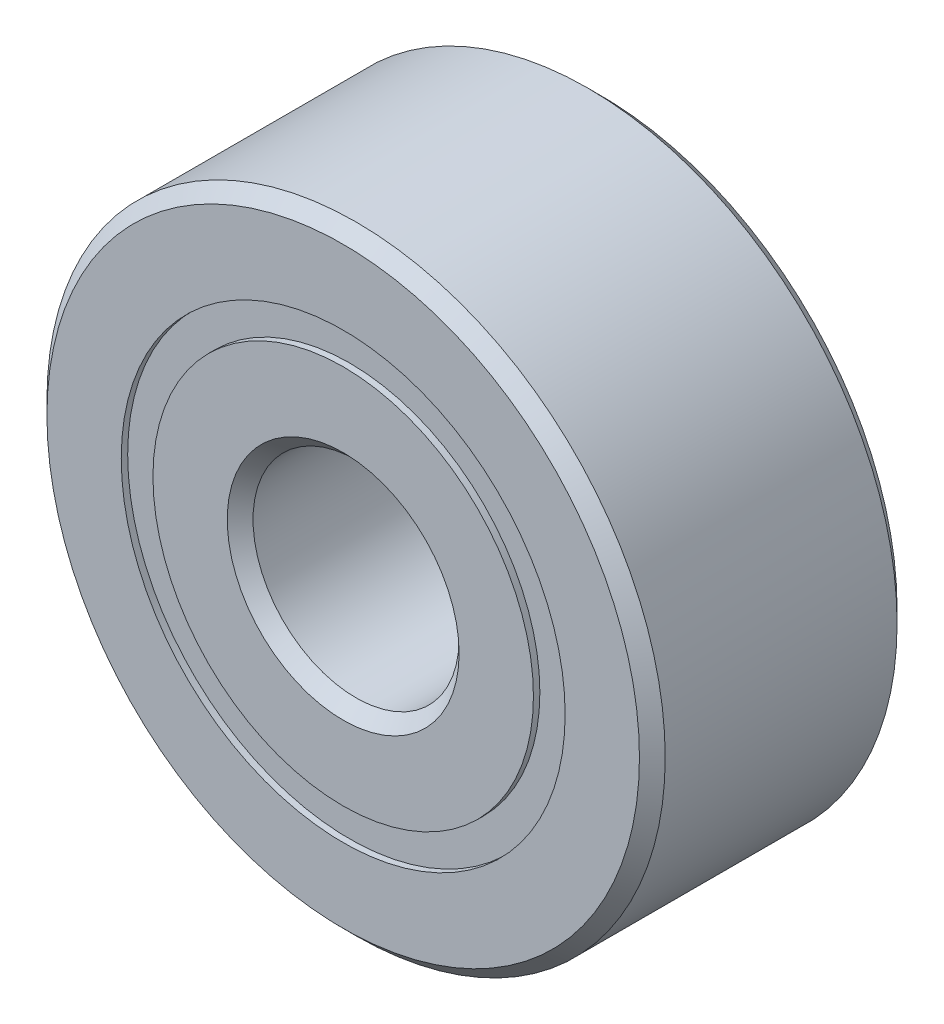
ISO-10303-21;
HEADER;
FILE_DESCRIPTION(('STEP AP214'),'2;1');
FILE_NAME('part.step','',(''),(''),'','','');
FILE_SCHEMA(('AUTOMOTIVE_DESIGN { 1 0 10303 214 1 1 1 1 }'));
ENDSEC;
DATA;
#1=APPLICATION_CONTEXT('core data for automotive mechanical design processes');
#2=APPLICATION_PROTOCOL_DEFINITION('international standard','automotive_design',2000,#1);
#3=PRODUCT_CONTEXT('',#1,'mechanical');
#4=PRODUCT('Part','Part','',(#3));
#5=PRODUCT_RELATED_PRODUCT_CATEGORY('part','',(#4));
#6=PRODUCT_DEFINITION_FORMATION('','',#4);
#7=PRODUCT_DEFINITION_CONTEXT('part definition',#1,'design');
#8=PRODUCT_DEFINITION('design','',#6,#7);
#9=PRODUCT_DEFINITION_SHAPE('','',#8);
#10=(LENGTH_UNIT() NAMED_UNIT(*) SI_UNIT(.MILLI.,.METRE.));
#11=(NAMED_UNIT(*) PLANE_ANGLE_UNIT() SI_UNIT($,.RADIAN.));
#12=(NAMED_UNIT(*) SI_UNIT($,.STERADIAN.) SOLID_ANGLE_UNIT());
#13=UNCERTAINTY_MEASURE_WITH_UNIT(LENGTH_MEASURE(1.E-05),#10,'distance_accuracy_value','');
#14=(GEOMETRIC_REPRESENTATION_CONTEXT(3) GLOBAL_UNCERTAINTY_ASSIGNED_CONTEXT((#13)) GLOBAL_UNIT_ASSIGNED_CONTEXT((#10,
#11,#12)) REPRESENTATION_CONTEXT('',''));
#15=CARTESIAN_POINT('',(0.,0.,0.));
#16=DIRECTION('',(0.,0.,1.));
#17=DIRECTION('',(1.,0.,0.));
#18=AXIS2_PLACEMENT_3D('',#15,#16,#17);
#19=CARTESIAN_POINT('',(0.,3.41923076923077,-1.88515625));
#20=DIRECTION('',(0.,0.,1.));
#21=DIRECTION('',(1.,0.,0.));
#22=AXIS2_PLACEMENT_3D('',#19,#20,#21);
#23=PLANE('',#22);
#24=CARTESIAN_POINT('',(0.,0.,-1.88515625));
#25=DIRECTION('',(0.,0.,1.));
#26=DIRECTION('',(1.,0.,0.));
#27=AXIS2_PLACEMENT_3D('',#24,#25,#26);
#28=CIRCLE('',#27,3.41923076923077);
#29=CARTESIAN_POINT('',(3.41923076923077,0.,-1.88515625));
#30=VERTEX_POINT('',#29);
#31=EDGE_CURVE('E57',#30,#30,#28,.T.);
#32=ORIENTED_EDGE('',*,*,#31,.F.);
#33=EDGE_LOOP('',(#32));
#34=FACE_BOUND('',#33,.T.);
#35=CARTESIAN_POINT('',(0.,0.,-1.88515625));
#36=DIRECTION('',(0.,0.,1.));
#37=DIRECTION('',(1.,0.,0.));
#38=AXIS2_PLACEMENT_3D('',#35,#36,#37);
#39=CIRCLE('',#38,2.93076923076923);
#40=CARTESIAN_POINT('',(2.93076923076923,0.,-1.88515625));
#41=VERTEX_POINT('',#40);
#42=EDGE_CURVE('E11',#41,#41,#39,.T.);
#43=ORIENTED_EDGE('',*,*,#42,.T.);
#44=EDGE_LOOP('',(#43));
#45=FACE_BOUND('',#44,.T.);
#46=ADVANCED_FACE('F43',(#34,#45),#23,.F.);
#47=CARTESIAN_POINT('',(0.,0.,1.984375));
#48=DIRECTION('',(0.,0.,1.));
#49=DIRECTION('',(1.,0.,0.));
#50=AXIS2_PLACEMENT_3D('',#47,#48,#49);
#51=CYLINDRICAL_SURFACE('',#50,2.93076923076923);
#52=ORIENTED_EDGE('',*,*,#42,.F.);
#53=EDGE_LOOP('',(#52));
#54=FACE_BOUND('',#53,.T.);
#55=CARTESIAN_POINT('',(0.,0.,-0.915136422466879));
#56=DIRECTION('',(0.,0.,1.));
#57=DIRECTION('',(1.,0.,0.));
#58=AXIS2_PLACEMENT_3D('',#55,#56,#57);
#59=CIRCLE('',#58,2.93076923076923);
#60=CARTESIAN_POINT('',(2.93076923076923,0.,-0.915136422466879));
#61=VERTEX_POINT('',#60);
#62=EDGE_CURVE('E49',#61,#61,#59,.T.);
#63=ORIENTED_EDGE('',*,*,#62,.T.);
#64=EDGE_LOOP('',(#63));
#65=FACE_BOUND('',#64,.T.);
#66=ADVANCED_FACE('F66',(#54,#65),#51,.F.);
#67=CARTESIAN_POINT('',(0.,3.41923076923077,-0.915136422466879));
#68=DIRECTION('',(0.,0.,-1.));
#69=DIRECTION('',(-1.,0.,0.));
#70=AXIS2_PLACEMENT_3D('',#67,#68,#69);
#71=PLANE('',#70);
#72=ORIENTED_EDGE('',*,*,#62,.F.);
#73=EDGE_LOOP('',(#72));
#74=FACE_BOUND('',#73,.T.);
#75=CARTESIAN_POINT('',(0.,0.,-0.915136422466878));
#76=DIRECTION('',(0.,0.,1.));
#77=DIRECTION('',(1.,0.,0.));
#78=AXIS2_PLACEMENT_3D('',#75,#76,#77);
#79=CIRCLE('',#78,3.41923076923077);
#80=CARTESIAN_POINT('',(3.41923076923077,0.,-0.915136422466878));
#81=VERTEX_POINT('',#80);
#82=EDGE_CURVE('E53',#81,#81,#79,.T.);
#83=ORIENTED_EDGE('',*,*,#82,.T.);
#84=EDGE_LOOP('',(#83));
#85=FACE_BOUND('',#84,.T.);
#86=ADVANCED_FACE('F70',(#74,#85),#71,.F.);
#87=CARTESIAN_POINT('',(0.,0.,1.984375));
#88=DIRECTION('',(0.,0.,1.));
#89=DIRECTION('',(1.,0.,0.));
#90=AXIS2_PLACEMENT_3D('',#87,#88,#89);
#91=CYLINDRICAL_SURFACE('',#90,3.41923076923077);
#92=ORIENTED_EDGE('',*,*,#82,.F.);
#93=EDGE_LOOP('',(#92));
#94=FACE_BOUND('',#93,.T.);
#95=ORIENTED_EDGE('',*,*,#31,.T.);
#96=EDGE_LOOP('',(#95));
#97=FACE_BOUND('',#96,.T.);
#98=ADVANCED_FACE('F63',(#94,#97),#91,.T.);
#99=CLOSED_SHELL('',(#46,#66,#86,#98));
#100=MANIFOLD_SOLID_BREP('B2',#99);
#101=CARTESIAN_POINT('',(0.,3.41923076923077,1.88515625));
#102=DIRECTION('',(0.,0.,-1.));
#103=DIRECTION('',(-1.,0.,0.));
#104=AXIS2_PLACEMENT_3D('',#101,#102,#103);
#105=PLANE('',#104);
#106=CARTESIAN_POINT('',(0.,0.,1.88515625));
#107=DIRECTION('',(0.,0.,1.));
#108=DIRECTION('',(1.,0.,0.));
#109=AXIS2_PLACEMENT_3D('',#106,#107,#108);
#110=CIRCLE('',#109,2.93076923076923);
#111=CARTESIAN_POINT('',(2.93076923076923,0.,1.88515625));
#112=VERTEX_POINT('',#111);
#113=EDGE_CURVE('E42',#112,#112,#110,.T.);
#114=ORIENTED_EDGE('',*,*,#113,.F.);
#115=EDGE_LOOP('',(#114));
#116=FACE_BOUND('',#115,.T.);
#117=CARTESIAN_POINT('',(0.,0.,1.88515625));
#118=DIRECTION('',(0.,0.,1.));
#119=DIRECTION('',(1.,0.,0.));
#120=AXIS2_PLACEMENT_3D('',#117,#118,#119);
#121=CIRCLE('',#120,3.41923076923077);
#122=CARTESIAN_POINT('',(3.41923076923077,0.,1.88515625));
#123=VERTEX_POINT('',#122);
#124=EDGE_CURVE('E124',#123,#123,#121,.T.);
#125=ORIENTED_EDGE('',*,*,#124,.T.);
#126=EDGE_LOOP('',(#125));
#127=FACE_BOUND('',#126,.T.);
#128=ADVANCED_FACE('F110',(#116,#127),#105,.F.);
#129=CARTESIAN_POINT('',(0.,0.,1.984375));
#130=DIRECTION('',(0.,0.,1.));
#131=DIRECTION('',(1.,0.,0.));
#132=AXIS2_PLACEMENT_3D('',#129,#130,#131);
#133=CYLINDRICAL_SURFACE('',#132,2.93076923076923);
#134=CARTESIAN_POINT('',(0.,0.,0.915136422466873));
#135=DIRECTION('',(0.,0.,1.));
#136=DIRECTION('',(1.,0.,0.));
#137=AXIS2_PLACEMENT_3D('',#134,#135,#136);
#138=CIRCLE('',#137,2.93076923076923);
#139=CARTESIAN_POINT('',(2.93076923076923,0.,0.915136422466873));
#140=VERTEX_POINT('',#139);
#141=EDGE_CURVE('E116',#140,#140,#138,.T.);
#142=ORIENTED_EDGE('',*,*,#141,.F.);
#143=EDGE_LOOP('',(#142));
#144=FACE_BOUND('',#143,.T.);
#145=ORIENTED_EDGE('',*,*,#113,.T.);
#146=EDGE_LOOP('',(#145));
#147=FACE_BOUND('',#146,.T.);
#148=ADVANCED_FACE('F139',(#144,#147),#133,.F.);
#149=CARTESIAN_POINT('',(0.,3.41923076923077,0.915136422466873));
#150=DIRECTION('',(0.,0.,1.));
#151=DIRECTION('',(1.,0.,0.));
#152=AXIS2_PLACEMENT_3D('',#149,#150,#151);
#153=PLANE('',#152);
#154=CARTESIAN_POINT('',(0.,0.,0.915136422466873));
#155=DIRECTION('',(0.,0.,1.));
#156=DIRECTION('',(1.,0.,0.));
#157=AXIS2_PLACEMENT_3D('',#154,#155,#156);
#158=CIRCLE('',#157,3.41923076923077);
#159=CARTESIAN_POINT('',(3.41923076923077,0.,0.915136422466873));
#160=VERTEX_POINT('',#159);
#161=EDGE_CURVE('E120',#160,#160,#158,.T.);
#162=ORIENTED_EDGE('',*,*,#161,.F.);
#163=EDGE_LOOP('',(#162));
#164=FACE_BOUND('',#163,.T.);
#165=ORIENTED_EDGE('',*,*,#141,.T.);
#166=EDGE_LOOP('',(#165));
#167=FACE_BOUND('',#166,.T.);
#168=ADVANCED_FACE('F134',(#164,#167),#153,.F.);
#169=CARTESIAN_POINT('',(0.,0.,1.984375));
#170=DIRECTION('',(0.,0.,1.));
#171=DIRECTION('',(1.,0.,0.));
#172=AXIS2_PLACEMENT_3D('',#169,#170,#171);
#173=CYLINDRICAL_SURFACE('',#172,3.41923076923077);
#174=ORIENTED_EDGE('',*,*,#124,.F.);
#175=EDGE_LOOP('',(#174));
#176=FACE_BOUND('',#175,.T.);
#177=ORIENTED_EDGE('',*,*,#161,.T.);
#178=EDGE_LOOP('',(#177));
#179=FACE_BOUND('',#178,.T.);
#180=ADVANCED_FACE('F131',(#176,#179),#173,.T.);
#181=CLOSED_SHELL('',(#128,#148,#168,#180));
#182=MANIFOLD_SOLID_BREP('B6',#181);
#183=CARTESIAN_POINT('',(-2.74963065701558,1.58750000000003,0.));
#184=DIRECTION('',(0.,0.,1.));
#185=DIRECTION('',(-0.866025403784433,0.50000000000001,0.));
#186=AXIS2_PLACEMENT_3D('',#183,#184,#185);
#187=SPHERICAL_SURFACE('',#186,0.915136422466876);
#188=CARTESIAN_POINT('',(-2.74963065701558,1.58750000000003,0.915136422466873));
#189=VERTEX_POINT('',#188);
#190=VERTEX_LOOP('',#189);
#191=FACE_BOUND('',#190,.T.);
#192=ADVANCED_FACE('F177',(#191),#187,.T.);
#193=CLOSED_SHELL('',(#192));
#194=MANIFOLD_SOLID_BREP('B37',#193);
#195=CARTESIAN_POINT('',(-2.74963065701561,-1.58749999999997,0.));
#196=DIRECTION('',(0.,0.,1.));
#197=DIRECTION('',(-0.866025403784443,-0.499999999999992,0.));
#198=AXIS2_PLACEMENT_3D('',#195,#196,#197);
#199=SPHERICAL_SURFACE('',#198,0.915136422466876);
#200=CARTESIAN_POINT('',(-2.74963065701561,-1.58749999999997,0.915136422466873));
#201=VERTEX_POINT('',#200);
#202=VERTEX_LOOP('',#201);
#203=FACE_BOUND('',#202,.T.);
#204=ADVANCED_FACE('F197',(#203),#199,.T.);
#205=CLOSED_SHELL('',(#204));
#206=MANIFOLD_SOLID_BREP('B106',#205);
#207=CARTESIAN_POINT('',(0.,-3.175,0.));
#208=DIRECTION('',(0.,0.,1.));
#209=DIRECTION('',(0.,-1.,0.));
#210=AXIS2_PLACEMENT_3D('',#207,#208,#209);
#211=SPHERICAL_SURFACE('',#210,0.915136422466876);
#212=CARTESIAN_POINT('',(0.,-3.175,0.915136422466873));
#213=VERTEX_POINT('',#212);
#214=VERTEX_LOOP('',#213);
#215=FACE_BOUND('',#214,.T.);
#216=ADVANCED_FACE('F217',(#215),#211,.T.);
#217=CLOSED_SHELL('',(#216));
#218=MANIFOLD_SOLID_BREP('B173',#217);
#219=CARTESIAN_POINT('',(2.74963065701559,-1.58750000000001,0.));
#220=DIRECTION('',(0.,0.,1.));
#221=DIRECTION('',(0.866025403784436,-0.500000000000004,0.));
#222=AXIS2_PLACEMENT_3D('',#219,#220,#221);
#223=SPHERICAL_SURFACE('',#222,0.915136422466876);
#224=CARTESIAN_POINT('',(2.74963065701559,-1.58750000000001,0.915136422466873));
#225=VERTEX_POINT('',#224);
#226=VERTEX_LOOP('',#225);
#227=FACE_BOUND('',#226,.T.);
#228=ADVANCED_FACE('F237',(#227),#223,.T.);
#229=CLOSED_SHELL('',(#228));
#230=MANIFOLD_SOLID_BREP('B193',#229);
#231=CARTESIAN_POINT('',(2.7496306570156,1.58749999999999,0.));
#232=DIRECTION('',(0.,0.,1.));
#233=DIRECTION('',(0.86602540378444,0.499999999999998,0.));
#234=AXIS2_PLACEMENT_3D('',#231,#232,#233);
#235=SPHERICAL_SURFACE('',#234,0.915136422466876);
#236=CARTESIAN_POINT('',(2.7496306570156,1.58749999999999,0.915136422466873));
#237=VERTEX_POINT('',#236);
#238=VERTEX_LOOP('',#237);
#239=FACE_BOUND('',#238,.T.);
#240=ADVANCED_FACE('F257',(#239),#235,.T.);
#241=CLOSED_SHELL('',(#240));
#242=MANIFOLD_SOLID_BREP('B213',#241);
#243=CARTESIAN_POINT('',(0.,3.175,0.));
#244=DIRECTION('',(0.,0.,1.));
#245=DIRECTION('',(0.,1.,0.));
#246=AXIS2_PLACEMENT_3D('',#243,#244,#245);
#247=SPHERICAL_SURFACE('',#246,0.915136422466876);
#248=CARTESIAN_POINT('',(0.,3.175,0.915136422466873));
#249=VERTEX_POINT('',#248);
#250=VERTEX_LOOP('',#249);
#251=FACE_BOUND('',#250,.T.);
#252=ADVANCED_FACE('F279',(#251),#247,.T.);
#253=CLOSED_SHELL('',(#252));
#254=MANIFOLD_SOLID_BREP('B233',#253);
#255=CARTESIAN_POINT('',(0.,2.93076923076923,1.984375));
#256=DIRECTION('',(0.,0.,-1.));
#257=DIRECTION('',(-1.,0.,0.));
#258=AXIS2_PLACEMENT_3D('',#255,#256,#257);
#259=PLANE('',#258);
#260=CARTESIAN_POINT('',(0.,0.,1.984375));
#261=DIRECTION('',(0.,0.,1.));
#262=DIRECTION('',(1.,0.,0.));
#263=AXIS2_PLACEMENT_3D('',#260,#261,#262);
#264=CIRCLE('',#263,1.7859375);
#265=CARTESIAN_POINT('',(1.7859375,0.,1.984375));
#266=VERTEX_POINT('',#265);
#267=EDGE_CURVE('E326',#266,#266,#264,.T.);
#268=ORIENTED_EDGE('',*,*,#267,.F.);
#269=EDGE_LOOP('',(#268));
#270=FACE_BOUND('',#269,.T.);
#271=CARTESIAN_POINT('',(0.,0.,1.98437500000001));
#272=DIRECTION('',(0.,0.,1.));
#273=DIRECTION('',(1.,0.,0.));
#274=AXIS2_PLACEMENT_3D('',#271,#272,#273);
#275=CIRCLE('',#274,2.93076923076923);
#276=CARTESIAN_POINT('',(2.93076923076923,0.,1.98437500000001));
#277=VERTEX_POINT('',#276);
#278=EDGE_CURVE('E278',#277,#277,#275,.T.);
#279=ORIENTED_EDGE('',*,*,#278,.T.);
#280=EDGE_LOOP('',(#279));
#281=FACE_BOUND('',#280,.T.);
#282=ADVANCED_FACE('F298',(#270,#281),#259,.F.);
#283=CARTESIAN_POINT('',(0.,0.,1.984375));
#284=DIRECTION('',(0.,0.,1.));
#285=DIRECTION('',(1.,0.,0.));
#286=AXIS2_PLACEMENT_3D('',#283,#284,#285);
#287=CYLINDRICAL_SURFACE('',#286,2.93076923076923);
#288=ORIENTED_EDGE('',*,*,#278,.F.);
#289=EDGE_LOOP('',(#288));
#290=FACE_BOUND('',#289,.T.);
#291=CARTESIAN_POINT('',(0.,0.,0.881944444444441));
#292=DIRECTION('',(0.,0.,1.));
#293=DIRECTION('',(1.,0.,0.));
#294=AXIS2_PLACEMENT_3D('',#291,#292,#293);
#295=CIRCLE('',#294,2.93076923076923);
#296=CARTESIAN_POINT('',(2.93076923076923,0.,0.881944444444441));
#297=VERTEX_POINT('',#296);
#298=EDGE_CURVE('E304',#297,#297,#295,.T.);
#299=ORIENTED_EDGE('',*,*,#298,.T.);
#300=EDGE_LOOP('',(#299));
#301=FACE_BOUND('',#300,.T.);
#302=ADVANCED_FACE('F333',(#290,#301),#287,.T.);
#303=CARTESIAN_POINT('',(0.,0.,0.));
#304=DIRECTION('',(0.,0.,1.));
#305=DIRECTION('',(1.,0.,0.));
#306=AXIS2_PLACEMENT_3D('',#303,#304,#305);
#307=TOROIDAL_SURFACE('',#306,3.175,0.915136422466872);
#308=ORIENTED_EDGE('',*,*,#298,.F.);
#309=EDGE_LOOP('',(#308));
#310=FACE_BOUND('',#309,.T.);
#311=CARTESIAN_POINT('',(0.,0.,-0.881944444444445));
#312=DIRECTION('',(0.,0.,1.));
#313=DIRECTION('',(1.,0.,0.));
#314=AXIS2_PLACEMENT_3D('',#311,#312,#313);
#315=CIRCLE('',#314,2.93076923076923);
#316=CARTESIAN_POINT('',(2.93076923076923,0.,-0.881944444444445));
#317=VERTEX_POINT('',#316);
#318=EDGE_CURVE('E308',#317,#317,#315,.T.);
#319=ORIENTED_EDGE('',*,*,#318,.T.);
#320=EDGE_LOOP('',(#319));
#321=FACE_BOUND('',#320,.T.);
#322=ADVANCED_FACE('F337',(#310,#321),#307,.F.);
#323=CARTESIAN_POINT('',(0.,0.,1.984375));
#324=DIRECTION('',(0.,0.,1.));
#325=DIRECTION('',(1.,0.,0.));
#326=AXIS2_PLACEMENT_3D('',#323,#324,#325);
#327=CYLINDRICAL_SURFACE('',#326,2.93076923076923);
#328=ORIENTED_EDGE('',*,*,#318,.F.);
#329=EDGE_LOOP('',(#328));
#330=FACE_BOUND('',#329,.T.);
#331=CARTESIAN_POINT('',(0.,0.,-1.98437500000001));
#332=DIRECTION('',(0.,0.,1.));
#333=DIRECTION('',(1.,0.,0.));
#334=AXIS2_PLACEMENT_3D('',#331,#332,#333);
#335=CIRCLE('',#334,2.93076923076923);
#336=CARTESIAN_POINT('',(2.93076923076923,0.,-1.98437500000001));
#337=VERTEX_POINT('',#336);
#338=EDGE_CURVE('E312',#337,#337,#335,.T.);
#339=ORIENTED_EDGE('',*,*,#338,.T.);
#340=EDGE_LOOP('',(#339));
#341=FACE_BOUND('',#340,.T.);
#342=ADVANCED_FACE('F342',(#330,#341),#327,.T.);
#343=CARTESIAN_POINT('',(0.,1.7859375,-1.98437500000001));
#344=DIRECTION('',(0.,0.,1.));
#345=DIRECTION('',(1.,0.,0.));
#346=AXIS2_PLACEMENT_3D('',#343,#344,#345);
#347=PLANE('',#346);
#348=ORIENTED_EDGE('',*,*,#338,.F.);
#349=EDGE_LOOP('',(#348));
#350=FACE_BOUND('',#349,.T.);
#351=CARTESIAN_POINT('',(0.,0.,-1.98437500000001));
#352=DIRECTION('',(0.,0.,1.));
#353=DIRECTION('',(1.,0.,0.));
#354=AXIS2_PLACEMENT_3D('',#351,#352,#353);
#355=CIRCLE('',#354,1.7859375);
#356=CARTESIAN_POINT('',(1.7859375,0.,-1.98437500000001));
#357=VERTEX_POINT('',#356);
#358=EDGE_CURVE('E317',#357,#357,#355,.T.);
#359=ORIENTED_EDGE('',*,*,#358,.T.);
#360=EDGE_LOOP('',(#359));
#361=FACE_BOUND('',#360,.T.);
#362=ADVANCED_FACE('F348',(#350,#361),#347,.F.);
#363=CARTESIAN_POINT('',(0.,0.,-1.78593750000001));
#364=DIRECTION('',(0.,0.,-1.));
#365=DIRECTION('',(-1.,0.,0.));
#366=AXIS2_PLACEMENT_3D('',#363,#364,#365);
#367=CONICAL_SURFACE('',#366,1.5875,0.785398163397453);
#368=ORIENTED_EDGE('',*,*,#358,.F.);
#369=EDGE_LOOP('',(#368));
#370=FACE_BOUND('',#369,.T.);
#371=CARTESIAN_POINT('',(0.,0.,-1.78593750000001));
#372=DIRECTION('',(0.,0.,1.));
#373=DIRECTION('',(1.,0.,0.));
#374=AXIS2_PLACEMENT_3D('',#371,#372,#373);
#375=CIRCLE('',#374,1.5875);
#376=CARTESIAN_POINT('',(1.5875,0.,-1.78593750000001));
#377=VERTEX_POINT('',#376);
#378=EDGE_CURVE('E320',#377,#377,#375,.T.);
#379=ORIENTED_EDGE('',*,*,#378,.T.);
#380=EDGE_LOOP('',(#379));
#381=FACE_BOUND('',#380,.T.);
#382=ADVANCED_FACE('F352',(#370,#381),#367,.F.);
#383=CARTESIAN_POINT('',(0.,0.,1.984375));
#384=DIRECTION('',(0.,0.,1.));
#385=DIRECTION('',(1.,0.,0.));
#386=AXIS2_PLACEMENT_3D('',#383,#384,#385);
#387=CYLINDRICAL_SURFACE('',#386,1.5875);
#388=ORIENTED_EDGE('',*,*,#378,.F.);
#389=EDGE_LOOP('',(#388));
#390=FACE_BOUND('',#389,.T.);
#391=CARTESIAN_POINT('',(0.,0.,1.7859375));
#392=DIRECTION('',(0.,0.,1.));
#393=DIRECTION('',(1.,0.,0.));
#394=AXIS2_PLACEMENT_3D('',#391,#392,#393);
#395=CIRCLE('',#394,1.5875);
#396=CARTESIAN_POINT('',(1.5875,0.,1.7859375));
#397=VERTEX_POINT('',#396);
#398=EDGE_CURVE('E323',#397,#397,#395,.T.);
#399=ORIENTED_EDGE('',*,*,#398,.T.);
#400=EDGE_LOOP('',(#399));
#401=FACE_BOUND('',#400,.T.);
#402=ADVANCED_FACE('F356',(#390,#401),#387,.F.);
#403=CARTESIAN_POINT('',(0.,0.,1.984375));
#404=DIRECTION('',(0.,0.,1.));
#405=DIRECTION('',(1.,0.,0.));
#406=AXIS2_PLACEMENT_3D('',#403,#404,#405);
#407=CONICAL_SURFACE('',#406,1.7859375,0.785398163397459);
#408=ORIENTED_EDGE('',*,*,#398,.F.);
#409=EDGE_LOOP('',(#408));
#410=FACE_BOUND('',#409,.T.);
#411=ORIENTED_EDGE('',*,*,#267,.T.);
#412=EDGE_LOOP('',(#411));
#413=FACE_BOUND('',#412,.T.);
#414=ADVANCED_FACE('F330',(#410,#413),#407,.F.);
#415=CLOSED_SHELL('',(#282,#302,#322,#342,#362,#382,#402,#414));
#416=MANIFOLD_SOLID_BREP('B253',#415);
#417=CARTESIAN_POINT('',(0.,0.,1.7859375));
#418=DIRECTION('',(0.,0.,-1.));
#419=DIRECTION('',(-1.,0.,0.));
#420=AXIS2_PLACEMENT_3D('',#417,#418,#419);
#421=CONICAL_SURFACE('',#420,4.7625,0.785398163397446);
#422=CARTESIAN_POINT('',(0.,0.,1.984375));
#423=DIRECTION('',(0.,0.,1.));
#424=DIRECTION('',(1.,0.,0.));
#425=AXIS2_PLACEMENT_3D('',#422,#423,#424);
#426=CIRCLE('',#425,4.5640625);
#427=CARTESIAN_POINT('',(4.5640625,0.,1.984375));
#428=VERTEX_POINT('',#427);
#429=EDGE_CURVE('E447',#428,#428,#426,.T.);
#430=ORIENTED_EDGE('',*,*,#429,.F.);
#431=EDGE_LOOP('',(#430));
#432=FACE_BOUND('',#431,.T.);
#433=CARTESIAN_POINT('',(0.,0.,1.7859375));
#434=DIRECTION('',(0.,0.,1.));
#435=DIRECTION('',(1.,0.,0.));
#436=AXIS2_PLACEMENT_3D('',#433,#434,#435);
#437=CIRCLE('',#436,4.7625);
#438=CARTESIAN_POINT('',(4.7625,0.,1.7859375));
#439=VERTEX_POINT('',#438);
#440=EDGE_CURVE('E297',#439,#439,#437,.T.);
#441=ORIENTED_EDGE('',*,*,#440,.T.);
#442=EDGE_LOOP('',(#441));
#443=FACE_BOUND('',#442,.T.);
#444=ADVANCED_FACE('F419',(#432,#443),#421,.T.);
#445=CARTESIAN_POINT('',(0.,0.,1.984375));
#446=DIRECTION('',(0.,0.,1.));
#447=DIRECTION('',(1.,0.,0.));
#448=AXIS2_PLACEMENT_3D('',#445,#446,#447);
#449=CYLINDRICAL_SURFACE('',#448,4.7625);
#450=ORIENTED_EDGE('',*,*,#440,.F.);
#451=EDGE_LOOP('',(#450));
#452=FACE_BOUND('',#451,.T.);
#453=CARTESIAN_POINT('',(0.,0.,-1.78593750000001));
#454=DIRECTION('',(0.,0.,1.));
#455=DIRECTION('',(1.,0.,0.));
#456=AXIS2_PLACEMENT_3D('',#453,#454,#455);
#457=CIRCLE('',#456,4.7625);
#458=CARTESIAN_POINT('',(4.7625,0.,-1.78593750000001));
#459=VERTEX_POINT('',#458);
#460=EDGE_CURVE('E425',#459,#459,#457,.T.);
#461=ORIENTED_EDGE('',*,*,#460,.T.);
#462=EDGE_LOOP('',(#461));
#463=FACE_BOUND('',#462,.T.);
#464=ADVANCED_FACE('F454',(#452,#463),#449,.T.);
#465=CARTESIAN_POINT('',(0.,0.,-1.98437500000001));
#466=DIRECTION('',(0.,0.,1.));
#467=DIRECTION('',(1.,0.,0.));
#468=AXIS2_PLACEMENT_3D('',#465,#466,#467);
#469=CONICAL_SURFACE('',#468,4.5640625,0.785398163397444);
#470=ORIENTED_EDGE('',*,*,#460,.F.);
#471=EDGE_LOOP('',(#470));
#472=FACE_BOUND('',#471,.T.);
#473=CARTESIAN_POINT('',(0.,0.,-1.98437500000001));
#474=DIRECTION('',(0.,0.,1.));
#475=DIRECTION('',(1.,0.,0.));
#476=AXIS2_PLACEMENT_3D('',#473,#474,#475);
#477=CIRCLE('',#476,4.5640625);
#478=CARTESIAN_POINT('',(4.5640625,0.,-1.98437500000001));
#479=VERTEX_POINT('',#478);
#480=EDGE_CURVE('E429',#479,#479,#477,.T.);
#481=ORIENTED_EDGE('',*,*,#480,.T.);
#482=EDGE_LOOP('',(#481));
#483=FACE_BOUND('',#482,.T.);
#484=ADVANCED_FACE('F458',(#472,#483),#469,.T.);
#485=CARTESIAN_POINT('',(0.,4.5640625,-1.98437500000001));
#486=DIRECTION('',(0.,0.,1.));
#487=DIRECTION('',(1.,0.,0.));
#488=AXIS2_PLACEMENT_3D('',#485,#486,#487);
#489=PLANE('',#488);
#490=ORIENTED_EDGE('',*,*,#480,.F.);
#491=EDGE_LOOP('',(#490));
#492=FACE_BOUND('',#491,.T.);
#493=CARTESIAN_POINT('',(0.,0.,-1.98437500000001));
#494=DIRECTION('',(0.,0.,1.));
#495=DIRECTION('',(1.,0.,0.));
#496=AXIS2_PLACEMENT_3D('',#493,#494,#495);
#497=CIRCLE('',#496,3.41923076923077);
#498=CARTESIAN_POINT('',(3.41923076923077,0.,-1.98437500000001));
#499=VERTEX_POINT('',#498);
#500=EDGE_CURVE('E433',#499,#499,#497,.T.);
#501=ORIENTED_EDGE('',*,*,#500,.T.);
#502=EDGE_LOOP('',(#501));
#503=FACE_BOUND('',#502,.T.);
#504=ADVANCED_FACE('F463',(#492,#503),#489,.F.);
#505=CARTESIAN_POINT('',(0.,0.,1.984375));
#506=DIRECTION('',(0.,0.,1.));
#507=DIRECTION('',(1.,0.,0.));
#508=AXIS2_PLACEMENT_3D('',#505,#506,#507);
#509=CYLINDRICAL_SURFACE('',#508,3.41923076923077);
#510=ORIENTED_EDGE('',*,*,#500,.F.);
#511=EDGE_LOOP('',(#510));
#512=FACE_BOUND('',#511,.T.);
#513=CARTESIAN_POINT('',(0.,0.,-0.881944444444447));
#514=DIRECTION('',(0.,0.,1.));
#515=DIRECTION('',(1.,0.,0.));
#516=AXIS2_PLACEMENT_3D('',#513,#514,#515);
#517=CIRCLE('',#516,3.41923076923077);
#518=CARTESIAN_POINT('',(3.41923076923077,0.,-0.881944444444447));
#519=VERTEX_POINT('',#518);
#520=EDGE_CURVE('E438',#519,#519,#517,.T.);
#521=ORIENTED_EDGE('',*,*,#520,.T.);
#522=EDGE_LOOP('',(#521));
#523=FACE_BOUND('',#522,.T.);
#524=ADVANCED_FACE('F469',(#512,#523),#509,.F.);
#525=CARTESIAN_POINT('',(0.,0.,0.));
#526=DIRECTION('',(0.,0.,1.));
#527=DIRECTION('',(1.,0.,0.));
#528=AXIS2_PLACEMENT_3D('',#525,#526,#527);
#529=TOROIDAL_SURFACE('',#528,3.175,0.915136422466876);
#530=ORIENTED_EDGE('',*,*,#520,.F.);
#531=EDGE_LOOP('',(#530));
#532=FACE_BOUND('',#531,.T.);
#533=CARTESIAN_POINT('',(0.,0.,0.881944444444441));
#534=DIRECTION('',(0.,0.,1.));
#535=DIRECTION('',(1.,0.,0.));
#536=AXIS2_PLACEMENT_3D('',#533,#534,#535);
#537=CIRCLE('',#536,3.41923076923077);
#538=CARTESIAN_POINT('',(3.41923076923077,0.,0.881944444444441));
#539=VERTEX_POINT('',#538);
#540=EDGE_CURVE('E441',#539,#539,#537,.T.);
#541=ORIENTED_EDGE('',*,*,#540,.T.);
#542=EDGE_LOOP('',(#541));
#543=FACE_BOUND('',#542,.T.);
#544=ADVANCED_FACE('F473',(#532,#543),#529,.F.);
#545=CARTESIAN_POINT('',(0.,0.,1.984375));
#546=DIRECTION('',(0.,0.,1.));
#547=DIRECTION('',(1.,0.,0.));
#548=AXIS2_PLACEMENT_3D('',#545,#546,#547);
#549=CYLINDRICAL_SURFACE('',#548,3.41923076923077);
#550=ORIENTED_EDGE('',*,*,#540,.F.);
#551=EDGE_LOOP('',(#550));
#552=FACE_BOUND('',#551,.T.);
#553=CARTESIAN_POINT('',(0.,0.,1.984375));
#554=DIRECTION('',(0.,0.,1.));
#555=DIRECTION('',(1.,0.,0.));
#556=AXIS2_PLACEMENT_3D('',#553,#554,#555);
#557=CIRCLE('',#556,3.41923076923077);
#558=CARTESIAN_POINT('',(3.41923076923077,0.,1.984375));
#559=VERTEX_POINT('',#558);
#560=EDGE_CURVE('E444',#559,#559,#557,.T.);
#561=ORIENTED_EDGE('',*,*,#560,.T.);
#562=EDGE_LOOP('',(#561));
#563=FACE_BOUND('',#562,.T.);
#564=ADVANCED_FACE('F477',(#552,#563),#549,.F.);
#565=CARTESIAN_POINT('',(0.,4.5640625,1.984375));
#566=DIRECTION('',(0.,0.,-1.));
#567=DIRECTION('',(-1.,0.,0.));
#568=AXIS2_PLACEMENT_3D('',#565,#566,#567);
#569=PLANE('',#568);
#570=ORIENTED_EDGE('',*,*,#560,.F.);
#571=EDGE_LOOP('',(#570));
#572=FACE_BOUND('',#571,.T.);
#573=ORIENTED_EDGE('',*,*,#429,.T.);
#574=EDGE_LOOP('',(#573));
#575=FACE_BOUND('',#574,.T.);
#576=ADVANCED_FACE('F451',(#572,#575),#569,.F.);
#577=CLOSED_SHELL('',(#444,#464,#484,#504,#524,#544,#564,#576));
#578=MANIFOLD_SOLID_BREP('B273',#577);
#579=ADVANCED_BREP_SHAPE_REPRESENTATION('',(#18,#100,#182,#194,#206,#218,#230,#242,#254,#416,
#578),#14);
#580=SHAPE_DEFINITION_REPRESENTATION(#9,#579);
ENDSEC;
END-ISO-10303-21;
